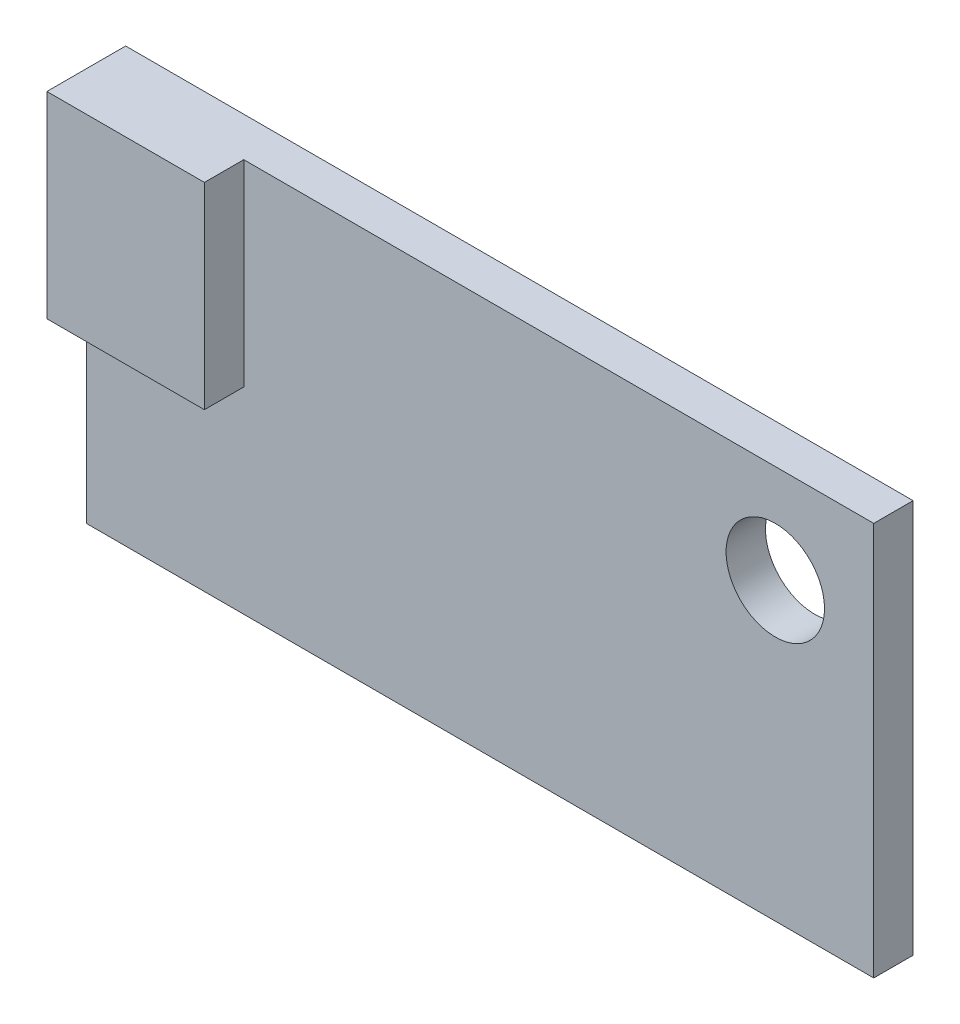
ISO-10303-21;
HEADER;
FILE_DESCRIPTION(('STEP AP214'),'2;1');
FILE_NAME('part.step','',(''),(''),'','','');
FILE_SCHEMA(('AUTOMOTIVE_DESIGN { 1 0 10303 214 1 1 1 1 }'));
ENDSEC;
DATA;
#1=APPLICATION_CONTEXT('core data for automotive mechanical design processes');
#2=APPLICATION_PROTOCOL_DEFINITION('international standard','automotive_design',2000,#1);
#3=PRODUCT_CONTEXT('',#1,'mechanical');
#4=PRODUCT('Part','Part','',(#3));
#5=PRODUCT_RELATED_PRODUCT_CATEGORY('part','',(#4));
#6=PRODUCT_DEFINITION_FORMATION('','',#4);
#7=PRODUCT_DEFINITION_CONTEXT('part definition',#1,'design');
#8=PRODUCT_DEFINITION('design','',#6,#7);
#9=PRODUCT_DEFINITION_SHAPE('','',#8);
#10=(LENGTH_UNIT() NAMED_UNIT(*) SI_UNIT(.MILLI.,.METRE.));
#11=(NAMED_UNIT(*) PLANE_ANGLE_UNIT() SI_UNIT($,.RADIAN.));
#12=(NAMED_UNIT(*) SI_UNIT($,.STERADIAN.) SOLID_ANGLE_UNIT());
#13=UNCERTAINTY_MEASURE_WITH_UNIT(LENGTH_MEASURE(1.E-05),#10,'distance_accuracy_value','');
#14=(GEOMETRIC_REPRESENTATION_CONTEXT(3) GLOBAL_UNCERTAINTY_ASSIGNED_CONTEXT((#13)) GLOBAL_UNIT_ASSIGNED_CONTEXT((#10,
#11,#12)) REPRESENTATION_CONTEXT('',''));
#15=CARTESIAN_POINT('',(0.,0.,0.));
#16=DIRECTION('',(0.,0.,1.));
#17=DIRECTION('',(1.,0.,0.));
#18=AXIS2_PLACEMENT_3D('',#15,#16,#17);
#19=CARTESIAN_POINT('',(0.,100.,10.));
#20=DIRECTION('',(0.,1.,0.));
#21=DIRECTION('',(0.,0.,1.));
#22=AXIS2_PLACEMENT_3D('',#19,#20,#21);
#23=PLANE('',#22);
#24=DIRECTION('',(1.,0.,0.));
#25=VECTOR('',#24,1.);
#26=CARTESIAN_POINT('',(0.,100.,0.));
#27=LINE('',#26,#25);
#28=CARTESIAN_POINT('',(0.,100.,0.));
#29=VERTEX_POINT('',#28);
#30=CARTESIAN_POINT('',(200.,100.,0.));
#31=VERTEX_POINT('',#30);
#32=EDGE_CURVE('E133',#29,#31,#27,.T.);
#33=ORIENTED_EDGE('',*,*,#32,.F.);
#34=DIRECTION('',(0.,0.,-1.));
#35=VECTOR('',#34,1.);
#36=CARTESIAN_POINT('',(0.,100.,10.));
#37=LINE('',#36,#35);
#38=CARTESIAN_POINT('',(0.,100.,20.));
#39=VERTEX_POINT('',#38);
#40=EDGE_CURVE('E11',#39,#29,#37,.T.);
#41=ORIENTED_EDGE('',*,*,#40,.F.);
#42=DIRECTION('',(-1.,0.,0.));
#43=VECTOR('',#42,1.);
#44=CARTESIAN_POINT('',(40.,100.,20.));
#45=LINE('',#44,#43);
#46=CARTESIAN_POINT('',(40.,100.,20.));
#47=VERTEX_POINT('',#46);
#48=EDGE_CURVE('E103',#47,#39,#45,.T.);
#49=ORIENTED_EDGE('',*,*,#48,.F.);
#50=DIRECTION('',(0.,0.,-1.));
#51=VECTOR('',#50,1.);
#52=CARTESIAN_POINT('',(40.,100.,20.));
#53=LINE('',#52,#51);
#54=CARTESIAN_POINT('',(40.,100.,10.));
#55=VERTEX_POINT('',#54);
#56=EDGE_CURVE('E107',#47,#55,#53,.T.);
#57=ORIENTED_EDGE('',*,*,#56,.T.);
#58=DIRECTION('',(1.,0.,0.));
#59=VECTOR('',#58,1.);
#60=CARTESIAN_POINT('',(0.,100.,10.));
#61=LINE('',#60,#59);
#62=CARTESIAN_POINT('',(200.,100.,10.));
#63=VERTEX_POINT('',#62);
#64=EDGE_CURVE('E67',#55,#63,#61,.T.);
#65=ORIENTED_EDGE('',*,*,#64,.T.);
#66=DIRECTION('',(0.,0.,-1.));
#67=VECTOR('',#66,1.);
#68=CARTESIAN_POINT('',(200.,100.,10.));
#69=LINE('',#68,#67);
#70=EDGE_CURVE('E156',#63,#31,#69,.T.);
#71=ORIENTED_EDGE('',*,*,#70,.T.);
#72=EDGE_LOOP('',(#33,#41,#49,#57,#65,#71));
#73=FACE_BOUND('',#72,.T.);
#74=ADVANCED_FACE('F45',(#73),#23,.T.);
#75=CARTESIAN_POINT('',(0.,0.,10.));
#76=DIRECTION('',(-1.,0.,0.));
#77=DIRECTION('',(0.,0.,1.));
#78=AXIS2_PLACEMENT_3D('',#75,#76,#77);
#79=PLANE('',#78);
#80=DIRECTION('',(0.,1.,0.));
#81=VECTOR('',#80,1.);
#82=CARTESIAN_POINT('',(0.,0.,0.));
#83=LINE('',#82,#81);
#84=CARTESIAN_POINT('',(0.,0.,0.));
#85=VERTEX_POINT('',#84);
#86=EDGE_CURVE('E161',#85,#29,#83,.T.);
#87=ORIENTED_EDGE('',*,*,#86,.F.);
#88=DIRECTION('',(0.,0.,-1.));
#89=VECTOR('',#88,1.);
#90=CARTESIAN_POINT('',(0.,0.,10.));
#91=LINE('',#90,#89);
#92=CARTESIAN_POINT('',(0.,0.,10.));
#93=VERTEX_POINT('',#92);
#94=EDGE_CURVE('E54',#93,#85,#91,.T.);
#95=ORIENTED_EDGE('',*,*,#94,.F.);
#96=DIRECTION('',(0.,1.,0.));
#97=VECTOR('',#96,1.);
#98=CARTESIAN_POINT('',(0.,0.,10.));
#99=LINE('',#98,#97);
#100=CARTESIAN_POINT('',(0.,50.,10.));
#101=VERTEX_POINT('',#100);
#102=EDGE_CURVE('E147',#93,#101,#99,.T.);
#103=ORIENTED_EDGE('',*,*,#102,.T.);
#104=DIRECTION('',(0.,0.,-1.));
#105=VECTOR('',#104,1.);
#106=CARTESIAN_POINT('',(0.,50.,20.));
#107=LINE('',#106,#105);
#108=CARTESIAN_POINT('',(0.,50.,20.));
#109=VERTEX_POINT('',#108);
#110=EDGE_CURVE('E128',#109,#101,#107,.T.);
#111=ORIENTED_EDGE('',*,*,#110,.F.);
#112=DIRECTION('',(0.,-1.,0.));
#113=VECTOR('',#112,1.);
#114=CARTESIAN_POINT('',(0.,100.,20.));
#115=LINE('',#114,#113);
#116=EDGE_CURVE('E112',#39,#109,#115,.T.);
#117=ORIENTED_EDGE('',*,*,#116,.F.);
#118=ORIENTED_EDGE('',*,*,#40,.T.);
#119=EDGE_LOOP('',(#87,#95,#103,#111,#117,#118));
#120=FACE_BOUND('',#119,.T.);
#121=ADVANCED_FACE('F187',(#120),#79,.T.);
#122=CARTESIAN_POINT('',(0.,0.,10.));
#123=DIRECTION('',(0.,1.,0.));
#124=DIRECTION('',(0.,0.,1.));
#125=AXIS2_PLACEMENT_3D('',#122,#123,#124);
#126=PLANE('',#125);
#127=DIRECTION('',(1.,0.,0.));
#128=VECTOR('',#127,1.);
#129=CARTESIAN_POINT('',(0.,0.,0.));
#130=LINE('',#129,#128);
#131=CARTESIAN_POINT('',(200.,0.,0.));
#132=VERTEX_POINT('',#131);
#133=EDGE_CURVE('E165',#85,#132,#130,.T.);
#134=ORIENTED_EDGE('',*,*,#133,.T.);
#135=DIRECTION('',(0.,0.,-1.));
#136=VECTOR('',#135,1.);
#137=CARTESIAN_POINT('',(200.,0.,10.));
#138=LINE('',#137,#136);
#139=CARTESIAN_POINT('',(200.,0.,10.));
#140=VERTEX_POINT('',#139);
#141=EDGE_CURVE('E174',#140,#132,#138,.T.);
#142=ORIENTED_EDGE('',*,*,#141,.F.);
#143=DIRECTION('',(1.,0.,0.));
#144=VECTOR('',#143,1.);
#145=CARTESIAN_POINT('',(0.,0.,10.));
#146=LINE('',#145,#144);
#147=EDGE_CURVE('E150',#93,#140,#146,.T.);
#148=ORIENTED_EDGE('',*,*,#147,.F.);
#149=ORIENTED_EDGE('',*,*,#94,.T.);
#150=EDGE_LOOP('',(#134,#142,#148,#149));
#151=FACE_BOUND('',#150,.T.);
#152=ADVANCED_FACE('F181',(#151),#126,.F.);
#153=CARTESIAN_POINT('',(175.,75.,10.));
#154=DIRECTION('',(0.,0.,-1.));
#155=DIRECTION('',(-1.,0.,0.));
#156=AXIS2_PLACEMENT_3D('',#153,#154,#155);
#157=CYLINDRICAL_SURFACE('',#156,12.5);
#158=CARTESIAN_POINT('',(175.,75.,10.));
#159=DIRECTION('',(0.,0.,1.));
#160=DIRECTION('',(1.,0.,0.));
#161=AXIS2_PLACEMENT_3D('',#158,#159,#160);
#162=CIRCLE('',#161,12.5);
#163=CARTESIAN_POINT('',(187.5,75.,10.));
#164=VERTEX_POINT('',#163);
#165=EDGE_CURVE('E140',#164,#164,#162,.T.);
#166=ORIENTED_EDGE('',*,*,#165,.T.);
#167=EDGE_LOOP('',(#166));
#168=FACE_BOUND('',#167,.T.);
#169=CARTESIAN_POINT('',(175.,75.,0.));
#170=DIRECTION('',(0.,0.,1.));
#171=DIRECTION('',(1.,0.,0.));
#172=AXIS2_PLACEMENT_3D('',#169,#170,#171);
#173=CIRCLE('',#172,12.5);
#174=CARTESIAN_POINT('',(187.5,75.,0.));
#175=VERTEX_POINT('',#174);
#176=EDGE_CURVE('E127',#175,#175,#173,.T.);
#177=ORIENTED_EDGE('',*,*,#176,.F.);
#178=EDGE_LOOP('',(#177));
#179=FACE_BOUND('',#178,.T.);
#180=ADVANCED_FACE('F47',(#168,#179),#157,.F.);
#181=CARTESIAN_POINT('',(200.,0.,10.));
#182=DIRECTION('',(-1.,0.,0.));
#183=DIRECTION('',(0.,0.,1.));
#184=AXIS2_PLACEMENT_3D('',#181,#182,#183);
#185=PLANE('',#184);
#186=DIRECTION('',(0.,1.,0.));
#187=VECTOR('',#186,1.);
#188=CARTESIAN_POINT('',(200.,0.,0.));
#189=LINE('',#188,#187);
#190=EDGE_CURVE('E144',#132,#31,#189,.T.);
#191=ORIENTED_EDGE('',*,*,#190,.T.);
#192=ORIENTED_EDGE('',*,*,#70,.F.);
#193=DIRECTION('',(0.,1.,0.));
#194=VECTOR('',#193,1.);
#195=CARTESIAN_POINT('',(200.,0.,10.));
#196=LINE('',#195,#194);
#197=EDGE_CURVE('E154',#140,#63,#196,.T.);
#198=ORIENTED_EDGE('',*,*,#197,.F.);
#199=ORIENTED_EDGE('',*,*,#141,.T.);
#200=EDGE_LOOP('',(#191,#192,#198,#199));
#201=FACE_BOUND('',#200,.T.);
#202=ADVANCED_FACE('F191',(#201),#185,.F.);
#203=CARTESIAN_POINT('',(0.,0.,10.));
#204=DIRECTION('',(0.,0.,1.));
#205=DIRECTION('',(1.,0.,0.));
#206=AXIS2_PLACEMENT_3D('',#203,#204,#205);
#207=PLANE('',#206);
#208=DIRECTION('',(0.,1.,0.));
#209=VECTOR('',#208,1.);
#210=CARTESIAN_POINT('',(40.,100.,10.));
#211=LINE('',#210,#209);
#212=CARTESIAN_POINT('',(40.,50.,10.));
#213=VERTEX_POINT('',#212);
#214=EDGE_CURVE('E125',#213,#55,#211,.T.);
#215=ORIENTED_EDGE('',*,*,#214,.F.);
#216=DIRECTION('',(1.,0.,0.));
#217=VECTOR('',#216,1.);
#218=CARTESIAN_POINT('',(40.,50.,10.));
#219=LINE('',#218,#217);
#220=EDGE_CURVE('E61',#101,#213,#219,.T.);
#221=ORIENTED_EDGE('',*,*,#220,.F.);
#222=ORIENTED_EDGE('',*,*,#102,.F.);
#223=ORIENTED_EDGE('',*,*,#147,.T.);
#224=ORIENTED_EDGE('',*,*,#197,.T.);
#225=ORIENTED_EDGE('',*,*,#64,.F.);
#226=EDGE_LOOP('',(#215,#221,#222,#223,#224,#225));
#227=FACE_BOUND('',#226,.T.);
#228=ORIENTED_EDGE('',*,*,#165,.F.);
#229=EDGE_LOOP('',(#228));
#230=FACE_BOUND('',#229,.T.);
#231=ADVANCED_FACE('F192',(#227,#230),#207,.T.);
#232=CARTESIAN_POINT('',(0.,0.,0.));
#233=DIRECTION('',(0.,0.,1.));
#234=DIRECTION('',(1.,0.,0.));
#235=AXIS2_PLACEMENT_3D('',#232,#233,#234);
#236=PLANE('',#235);
#237=ORIENTED_EDGE('',*,*,#176,.T.);
#238=EDGE_LOOP('',(#237));
#239=FACE_BOUND('',#238,.T.);
#240=ORIENTED_EDGE('',*,*,#32,.T.);
#241=ORIENTED_EDGE('',*,*,#190,.F.);
#242=ORIENTED_EDGE('',*,*,#133,.F.);
#243=ORIENTED_EDGE('',*,*,#86,.T.);
#244=EDGE_LOOP('',(#240,#241,#242,#243));
#245=FACE_BOUND('',#244,.T.);
#246=ADVANCED_FACE('F186',(#239,#245),#236,.F.);
#247=CARTESIAN_POINT('',(40.,100.,20.));
#248=DIRECTION('',(-1.,0.,0.));
#249=DIRECTION('',(0.,-1.,0.));
#250=AXIS2_PLACEMENT_3D('',#247,#248,#249);
#251=PLANE('',#250);
#252=ORIENTED_EDGE('',*,*,#214,.T.);
#253=ORIENTED_EDGE('',*,*,#56,.F.);
#254=DIRECTION('',(0.,1.,0.));
#255=VECTOR('',#254,1.);
#256=CARTESIAN_POINT('',(40.,100.,20.));
#257=LINE('',#256,#255);
#258=CARTESIAN_POINT('',(40.,50.,20.));
#259=VERTEX_POINT('',#258);
#260=EDGE_CURVE('E113',#259,#47,#257,.T.);
#261=ORIENTED_EDGE('',*,*,#260,.F.);
#262=DIRECTION('',(0.,0.,-1.));
#263=VECTOR('',#262,1.);
#264=CARTESIAN_POINT('',(40.,50.,20.));
#265=LINE('',#264,#263);
#266=EDGE_CURVE('E136',#259,#213,#265,.T.);
#267=ORIENTED_EDGE('',*,*,#266,.T.);
#268=EDGE_LOOP('',(#252,#253,#261,#267));
#269=FACE_BOUND('',#268,.T.);
#270=ADVANCED_FACE('F124',(#269),#251,.F.);
#271=CARTESIAN_POINT('',(40.,50.,20.));
#272=DIRECTION('',(0.,1.,0.));
#273=DIRECTION('',(0.,0.,1.));
#274=AXIS2_PLACEMENT_3D('',#271,#272,#273);
#275=PLANE('',#274);
#276=ORIENTED_EDGE('',*,*,#220,.T.);
#277=ORIENTED_EDGE('',*,*,#266,.F.);
#278=DIRECTION('',(1.,0.,0.));
#279=VECTOR('',#278,1.);
#280=CARTESIAN_POINT('',(40.,50.,20.));
#281=LINE('',#280,#279);
#282=EDGE_CURVE('E118',#109,#259,#281,.T.);
#283=ORIENTED_EDGE('',*,*,#282,.F.);
#284=ORIENTED_EDGE('',*,*,#110,.T.);
#285=EDGE_LOOP('',(#276,#277,#283,#284));
#286=FACE_BOUND('',#285,.T.);
#287=ADVANCED_FACE('F195',(#286),#275,.F.);
#288=CARTESIAN_POINT('',(0.,0.,20.));
#289=DIRECTION('',(0.,0.,-1.));
#290=DIRECTION('',(-1.,0.,0.));
#291=AXIS2_PLACEMENT_3D('',#288,#289,#290);
#292=PLANE('',#291);
#293=ORIENTED_EDGE('',*,*,#260,.T.);
#294=ORIENTED_EDGE('',*,*,#48,.T.);
#295=ORIENTED_EDGE('',*,*,#116,.T.);
#296=ORIENTED_EDGE('',*,*,#282,.T.);
#297=EDGE_LOOP('',(#293,#294,#295,#296));
#298=FACE_BOUND('',#297,.T.);
#299=ADVANCED_FACE('F116',(#298),#292,.F.);
#300=CLOSED_SHELL('',(#74,#121,#152,#180,#202,#231,#246,#270,#287,#299));
#301=MANIFOLD_SOLID_BREP('B2',#300);
#302=ADVANCED_BREP_SHAPE_REPRESENTATION('',(#18,#301),#14);
#303=SHAPE_DEFINITION_REPRESENTATION(#9,#302);
ENDSEC;
END-ISO-10303-21;
